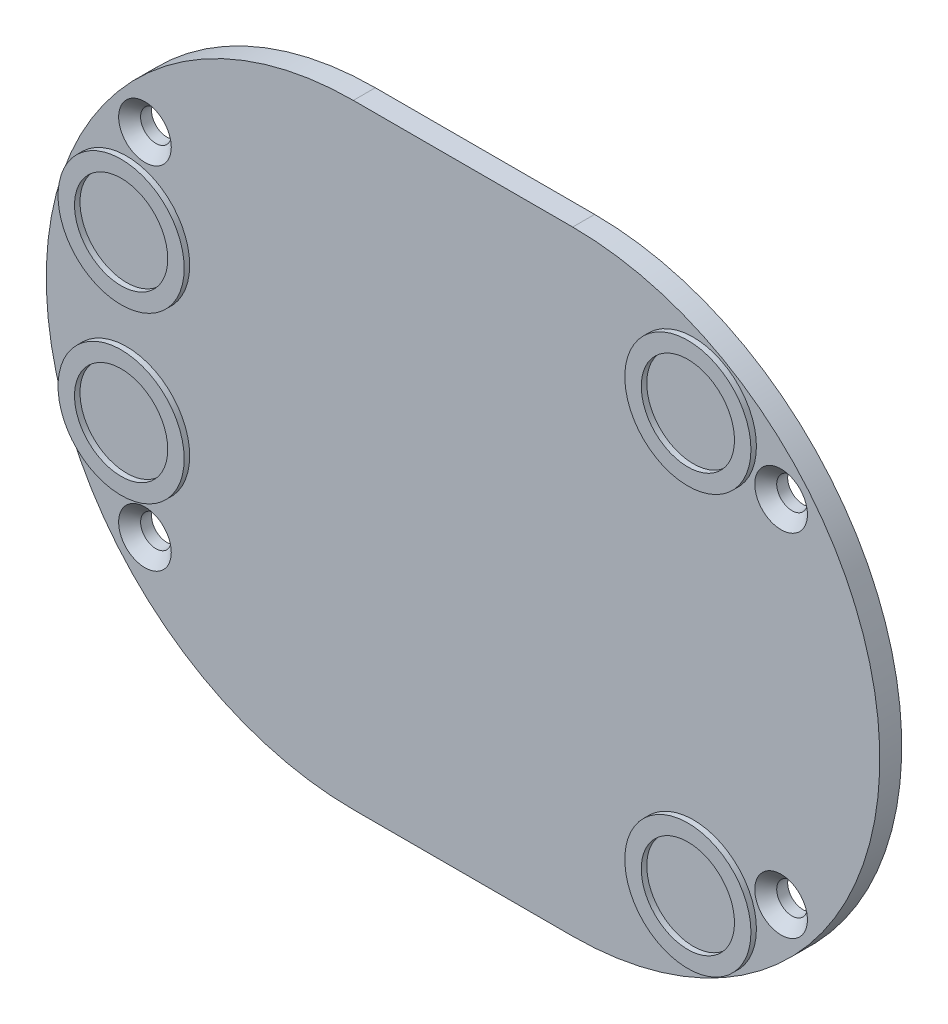
ISO-10303-21;
HEADER;
FILE_DESCRIPTION(('STEP AP214'),'2;1');
FILE_NAME('part.step','',(''),(''),'','','');
FILE_SCHEMA(('AUTOMOTIVE_DESIGN { 1 0 10303 214 1 1 1 1 }'));
ENDSEC;
DATA;
#1=APPLICATION_CONTEXT('core data for automotive mechanical design processes');
#2=APPLICATION_PROTOCOL_DEFINITION('international standard','automotive_design',2000,#1);
#3=PRODUCT_CONTEXT('',#1,'mechanical');
#4=PRODUCT('Part','Part','',(#3));
#5=PRODUCT_RELATED_PRODUCT_CATEGORY('part','',(#4));
#6=PRODUCT_DEFINITION_FORMATION('','',#4);
#7=PRODUCT_DEFINITION_CONTEXT('part definition',#1,'design');
#8=PRODUCT_DEFINITION('design','',#6,#7);
#9=PRODUCT_DEFINITION_SHAPE('','',#8);
#10=(LENGTH_UNIT() NAMED_UNIT(*) SI_UNIT(.MILLI.,.METRE.));
#11=(NAMED_UNIT(*) PLANE_ANGLE_UNIT() SI_UNIT($,.RADIAN.));
#12=(NAMED_UNIT(*) SI_UNIT($,.STERADIAN.) SOLID_ANGLE_UNIT());
#13=UNCERTAINTY_MEASURE_WITH_UNIT(LENGTH_MEASURE(1.E-05),#10,'distance_accuracy_value','');
#14=(GEOMETRIC_REPRESENTATION_CONTEXT(3) GLOBAL_UNCERTAINTY_ASSIGNED_CONTEXT((#13)) GLOBAL_UNIT_ASSIGNED_CONTEXT((#10,
#11,#12)) REPRESENTATION_CONTEXT('',''));
#15=CARTESIAN_POINT('',(0.,0.,0.));
#16=DIRECTION('',(0.,0.,1.));
#17=DIRECTION('',(1.,0.,0.));
#18=AXIS2_PLACEMENT_3D('',#15,#16,#17);
#19=CARTESIAN_POINT('',(-10.,0.,2.));
#20=DIRECTION('',(0.,0.,-1.));
#21=DIRECTION('',(-1.,0.,0.));
#22=AXIS2_PLACEMENT_3D('',#19,#20,#21);
#23=CYLINDRICAL_SURFACE('',#22,28.);
#24=CARTESIAN_POINT('',(-10.,0.,0.));
#25=DIRECTION('',(0.,0.,1.));
#26=DIRECTION('',(1.,0.,0.));
#27=AXIS2_PLACEMENT_3D('',#24,#25,#26);
#28=CIRCLE('',#27,28.);
#29=CARTESIAN_POINT('',(-10.,28.,0.));
#30=VERTEX_POINT('',#29);
#31=CARTESIAN_POINT('',(-10.,-28.,0.));
#32=VERTEX_POINT('',#31);
#33=EDGE_CURVE('E249',#30,#32,#28,.T.);
#34=ORIENTED_EDGE('',*,*,#33,.T.);
#35=DIRECTION('',(0.,0.,-1.));
#36=VECTOR('',#35,1.);
#37=CARTESIAN_POINT('',(-10.,-28.,2.));
#38=LINE('',#37,#36);
#39=CARTESIAN_POINT('',(-10.,-28.,2.));
#40=VERTEX_POINT('',#39);
#41=EDGE_CURVE('E265',#40,#32,#38,.T.);
#42=ORIENTED_EDGE('',*,*,#41,.F.);
#43=CARTESIAN_POINT('',(-10.,0.,2.));
#44=DIRECTION('',(0.,0.,1.));
#45=DIRECTION('',(1.,0.,0.));
#46=AXIS2_PLACEMENT_3D('',#43,#44,#45);
#47=CIRCLE('',#46,28.);
#48=CARTESIAN_POINT('',(-10.,28.,2.));
#49=VERTEX_POINT('',#48);
#50=EDGE_CURVE('E237',#49,#40,#47,.T.);
#51=ORIENTED_EDGE('',*,*,#50,.F.);
#52=DIRECTION('',(0.,0.,-1.));
#53=VECTOR('',#52,1.);
#54=CARTESIAN_POINT('',(-10.,28.,2.));
#55=LINE('',#54,#53);
#56=EDGE_CURVE('E248',#49,#30,#55,.T.);
#57=ORIENTED_EDGE('',*,*,#56,.T.);
#58=EDGE_LOOP('',(#34,#42,#51,#57));
#59=FACE_BOUND('',#58,.T.);
#60=ADVANCED_FACE('F62',(#59),#23,.T.);
#61=CARTESIAN_POINT('',(10.,-28.,2.));
#62=DIRECTION('',(0.,-1.,0.));
#63=DIRECTION('',(1.,0.,0.));
#64=AXIS2_PLACEMENT_3D('',#61,#62,#63);
#65=PLANE('',#64);
#66=DIRECTION('',(-1.,0.,0.));
#67=VECTOR('',#66,1.);
#68=CARTESIAN_POINT('',(10.,-28.,0.));
#69=LINE('',#68,#67);
#70=CARTESIAN_POINT('',(10.,-28.,0.));
#71=VERTEX_POINT('',#70);
#72=EDGE_CURVE('E252',#71,#32,#69,.T.);
#73=ORIENTED_EDGE('',*,*,#72,.F.);
#74=DIRECTION('',(0.,0.,-1.));
#75=VECTOR('',#74,1.);
#76=CARTESIAN_POINT('',(10.,-28.,2.));
#77=LINE('',#76,#75);
#78=CARTESIAN_POINT('',(10.,-28.,2.));
#79=VERTEX_POINT('',#78);
#80=EDGE_CURVE('E263',#79,#71,#77,.T.);
#81=ORIENTED_EDGE('',*,*,#80,.F.);
#82=DIRECTION('',(-1.,0.,0.));
#83=VECTOR('',#82,1.);
#84=CARTESIAN_POINT('',(10.,-28.,2.));
#85=LINE('',#84,#83);
#86=EDGE_CURVE('E239',#79,#40,#85,.T.);
#87=ORIENTED_EDGE('',*,*,#86,.T.);
#88=ORIENTED_EDGE('',*,*,#41,.T.);
#89=EDGE_LOOP('',(#73,#81,#87,#88));
#90=FACE_BOUND('',#89,.T.);
#91=ADVANCED_FACE('F323',(#90),#65,.T.);
#92=CARTESIAN_POINT('',(10.,0.,2.));
#93=DIRECTION('',(0.,0.,-1.));
#94=DIRECTION('',(-1.,0.,0.));
#95=AXIS2_PLACEMENT_3D('',#92,#93,#94);
#96=CYLINDRICAL_SURFACE('',#95,28.);
#97=CARTESIAN_POINT('',(10.,0.,0.));
#98=DIRECTION('',(0.,0.,1.));
#99=DIRECTION('',(1.,0.,0.));
#100=AXIS2_PLACEMENT_3D('',#97,#98,#99);
#101=CIRCLE('',#100,28.);
#102=CARTESIAN_POINT('',(10.,28.,0.));
#103=VERTEX_POINT('',#102);
#104=EDGE_CURVE('E255',#71,#103,#101,.T.);
#105=ORIENTED_EDGE('',*,*,#104,.T.);
#106=DIRECTION('',(0.,0.,-1.));
#107=VECTOR('',#106,1.);
#108=CARTESIAN_POINT('',(10.,28.,2.));
#109=LINE('',#108,#107);
#110=CARTESIAN_POINT('',(10.,28.,2.));
#111=VERTEX_POINT('',#110);
#112=EDGE_CURVE('E261',#111,#103,#109,.T.);
#113=ORIENTED_EDGE('',*,*,#112,.F.);
#114=CARTESIAN_POINT('',(10.,0.,2.));
#115=DIRECTION('',(0.,0.,1.));
#116=DIRECTION('',(1.,0.,0.));
#117=AXIS2_PLACEMENT_3D('',#114,#115,#116);
#118=CIRCLE('',#117,28.);
#119=EDGE_CURVE('E243',#79,#111,#118,.T.);
#120=ORIENTED_EDGE('',*,*,#119,.F.);
#121=ORIENTED_EDGE('',*,*,#80,.T.);
#122=EDGE_LOOP('',(#105,#113,#120,#121));
#123=FACE_BOUND('',#122,.T.);
#124=ADVANCED_FACE('F329',(#123),#96,.T.);
#125=CARTESIAN_POINT('',(-10.,28.,2.));
#126=DIRECTION('',(0.,1.,0.));
#127=DIRECTION('',(-1.,0.,0.));
#128=AXIS2_PLACEMENT_3D('',#125,#126,#127);
#129=PLANE('',#128);
#130=DIRECTION('',(1.,0.,0.));
#131=VECTOR('',#130,1.);
#132=CARTESIAN_POINT('',(-10.,28.,0.));
#133=LINE('',#132,#131);
#134=EDGE_CURVE('E240',#30,#103,#133,.T.);
#135=ORIENTED_EDGE('',*,*,#134,.F.);
#136=ORIENTED_EDGE('',*,*,#56,.F.);
#137=DIRECTION('',(1.,0.,0.));
#138=VECTOR('',#137,1.);
#139=CARTESIAN_POINT('',(-10.,28.,2.));
#140=LINE('',#139,#138);
#141=EDGE_CURVE('E245',#49,#111,#140,.T.);
#142=ORIENTED_EDGE('',*,*,#141,.T.);
#143=ORIENTED_EDGE('',*,*,#112,.T.);
#144=EDGE_LOOP('',(#135,#136,#142,#143));
#145=FACE_BOUND('',#144,.T.);
#146=ADVANCED_FACE('F589',(#145),#129,.T.);
#147=CARTESIAN_POINT('',(-10.,0.,2.));
#148=DIRECTION('',(0.,0.,1.));
#149=DIRECTION('',(1.,0.,0.));
#150=AXIS2_PLACEMENT_3D('',#147,#148,#149);
#151=PLANE('',#150);
#152=CARTESIAN_POINT('',(-30.67323765729,-7.52444315316473,2.));
#153=DIRECTION('',(0.,0.,1.));
#154=DIRECTION('',(1.,0.,0.));
#155=AXIS2_PLACEMENT_3D('',#152,#153,#154);
#156=CIRCLE('',#155,5.75);
#157=CARTESIAN_POINT('',(-24.92323765729,-7.52444315316473,2.));
#158=VERTEX_POINT('',#157);
#159=EDGE_CURVE('E194',#158,#158,#156,.T.);
#160=ORIENTED_EDGE('',*,*,#159,.F.);
#161=EDGE_LOOP('',(#160));
#162=FACE_BOUND('',#161,.T.);
#163=CARTESIAN_POINT('',(21.0000000000001,19.0525588832576,2.));
#164=DIRECTION('',(0.,0.,1.));
#165=DIRECTION('',(1.,0.,0.));
#166=AXIS2_PLACEMENT_3D('',#163,#164,#165);
#167=CIRCLE('',#166,5.75);
#168=CARTESIAN_POINT('',(26.7500000000001,19.0525588832576,2.));
#169=VERTEX_POINT('',#168);
#170=EDGE_CURVE('E176',#169,#169,#167,.T.);
#171=ORIENTED_EDGE('',*,*,#170,.F.);
#172=EDGE_LOOP('',(#171));
#173=FACE_BOUND('',#172,.T.);
#174=CARTESIAN_POINT('',(21.0000000000001,-19.0525588832576,2.));
#175=DIRECTION('',(0.,0.,1.));
#176=DIRECTION('',(1.,0.,0.));
#177=AXIS2_PLACEMENT_3D('',#174,#175,#176);
#178=CIRCLE('',#177,5.75);
#179=CARTESIAN_POINT('',(26.7500000000001,-19.0525588832576,2.));
#180=VERTEX_POINT('',#179);
#181=EDGE_CURVE('E185',#180,#180,#178,.T.);
#182=ORIENTED_EDGE('',*,*,#181,.F.);
#183=EDGE_LOOP('',(#182));
#184=FACE_BOUND('',#183,.T.);
#185=CARTESIAN_POINT('',(-30.67323765729,7.52444315316473,2.));
#186=DIRECTION('',(0.,0.,1.));
#187=DIRECTION('',(1.,0.,0.));
#188=AXIS2_PLACEMENT_3D('',#185,#186,#187);
#189=CIRCLE('',#188,5.75);
#190=CARTESIAN_POINT('',(-24.92323765729,7.52444315316473,2.));
#191=VERTEX_POINT('',#190);
#192=EDGE_CURVE('E203',#191,#191,#189,.T.);
#193=ORIENTED_EDGE('',*,*,#192,.F.);
#194=EDGE_LOOP('',(#193));
#195=FACE_BOUND('',#194,.T.);
#196=CARTESIAN_POINT('',(-29.,16.,2.));
#197=DIRECTION('',(0.,0.,1.));
#198=DIRECTION('',(1.,0.,0.));
#199=AXIS2_PLACEMENT_3D('',#196,#197,#198);
#200=CIRCLE('',#199,2.4);
#201=CARTESIAN_POINT('',(-26.6,16.,2.));
#202=VERTEX_POINT('',#201);
#203=EDGE_CURVE('E207',#202,#202,#200,.T.);
#204=ORIENTED_EDGE('',*,*,#203,.F.);
#205=EDGE_LOOP('',(#204));
#206=FACE_BOUND('',#205,.T.);
#207=CARTESIAN_POINT('',(-29.,-16.,2.));
#208=DIRECTION('',(0.,0.,1.));
#209=DIRECTION('',(1.,0.,0.));
#210=AXIS2_PLACEMENT_3D('',#207,#208,#209);
#211=CIRCLE('',#210,2.4);
#212=CARTESIAN_POINT('',(-26.6,-16.,2.));
#213=VERTEX_POINT('',#212);
#214=EDGE_CURVE('E216',#213,#213,#211,.T.);
#215=ORIENTED_EDGE('',*,*,#214,.F.);
#216=EDGE_LOOP('',(#215));
#217=FACE_BOUND('',#216,.T.);
#218=CARTESIAN_POINT('',(29.,16.,2.));
#219=DIRECTION('',(0.,0.,1.));
#220=DIRECTION('',(1.,0.,0.));
#221=AXIS2_PLACEMENT_3D('',#218,#219,#220);
#222=CIRCLE('',#221,2.4);
#223=CARTESIAN_POINT('',(31.4,16.,2.));
#224=VERTEX_POINT('',#223);
#225=EDGE_CURVE('E223',#224,#224,#222,.T.);
#226=ORIENTED_EDGE('',*,*,#225,.F.);
#227=EDGE_LOOP('',(#226));
#228=FACE_BOUND('',#227,.T.);
#229=CARTESIAN_POINT('',(29.,-16.,2.));
#230=DIRECTION('',(0.,0.,1.));
#231=DIRECTION('',(1.,0.,0.));
#232=AXIS2_PLACEMENT_3D('',#229,#230,#231);
#233=CIRCLE('',#232,2.4);
#234=CARTESIAN_POINT('',(31.4,-16.,2.));
#235=VERTEX_POINT('',#234);
#236=EDGE_CURVE('E230',#235,#235,#233,.T.);
#237=ORIENTED_EDGE('',*,*,#236,.F.);
#238=EDGE_LOOP('',(#237));
#239=FACE_BOUND('',#238,.T.);
#240=ORIENTED_EDGE('',*,*,#50,.T.);
#241=ORIENTED_EDGE('',*,*,#86,.F.);
#242=ORIENTED_EDGE('',*,*,#119,.T.);
#243=ORIENTED_EDGE('',*,*,#141,.F.);
#244=EDGE_LOOP('',(#240,#241,#242,#243));
#245=FACE_BOUND('',#244,.T.);
#246=ADVANCED_FACE('F391',(#162,#173,#184,#195,#206,#217,#228,#239,#245),#151,.T.);
#247=CARTESIAN_POINT('',(-10.,0.,0.));
#248=DIRECTION('',(0.,0.,1.));
#249=DIRECTION('',(1.,0.,0.));
#250=AXIS2_PLACEMENT_3D('',#247,#248,#249);
#251=PLANE('',#250);
#252=CARTESIAN_POINT('',(-10.,0.,0.));
#253=DIRECTION('',(0.,0.,1.));
#254=DIRECTION('',(1.,0.,0.));
#255=AXIS2_PLACEMENT_3D('',#252,#253,#254);
#256=CIRCLE('',#255,20.5);
#257=CARTESIAN_POINT('',(-27.6609508989296,-10.4086893192946,0.));
#258=VERTEX_POINT('',#257);
#259=CARTESIAN_POINT('',(-8.20469615485114,-20.4212361061615,0.));
#260=VERTEX_POINT('',#259);
#261=EDGE_CURVE('E294',#258,#260,#256,.T.);
#262=ORIENTED_EDGE('',*,*,#261,.T.);
#263=DIRECTION('',(0.0875757973243352,-0.996157858837146,0.));
#264=VECTOR('',#263,1.);
#265=CARTESIAN_POINT('',(-10.,0.,0.));
#266=LINE('',#265,#264);
#267=CARTESIAN_POINT('',(-8.68636304013498,-14.9423678825572,0.));
#268=VERTEX_POINT('',#267);
#269=EDGE_CURVE('E287',#268,#260,#266,.T.);
#270=ORIENTED_EDGE('',*,*,#269,.F.);
#271=CARTESIAN_POINT('',(-10.,0.,0.));
#272=DIRECTION('',(0.,0.,1.));
#273=DIRECTION('',(1.,0.,0.));
#274=AXIS2_PLACEMENT_3D('',#271,#272,#273);
#275=CIRCLE('',#274,15.);
#276=CARTESIAN_POINT('',(-22.9226469992168,-7.61611413606923,0.));
#277=VERTEX_POINT('',#276);
#278=EDGE_CURVE('E291',#268,#277,#275,.F.);
#279=ORIENTED_EDGE('',*,*,#278,.T.);
#280=DIRECTION('',(0.861509799947785,0.507740942404616,0.));
#281=VECTOR('',#280,1.);
#282=CARTESIAN_POINT('',(-10.,0.,0.));
#283=LINE('',#282,#281);
#284=EDGE_CURVE('E289',#258,#277,#283,.T.);
#285=ORIENTED_EDGE('',*,*,#284,.F.);
#286=EDGE_LOOP('',(#262,#270,#279,#285));
#287=FACE_BOUND('',#286,.T.);
#288=CARTESIAN_POINT('',(-29.,16.,0.));
#289=DIRECTION('',(0.,0.,1.));
#290=DIRECTION('',(1.,0.,0.));
#291=AXIS2_PLACEMENT_3D('',#288,#289,#290);
#292=CIRCLE('',#291,1.4);
#293=CARTESIAN_POINT('',(-27.6,16.,0.));
#294=VERTEX_POINT('',#293);
#295=EDGE_CURVE('E215',#294,#294,#292,.T.);
#296=ORIENTED_EDGE('',*,*,#295,.T.);
#297=EDGE_LOOP('',(#296));
#298=FACE_BOUND('',#297,.T.);
#299=CARTESIAN_POINT('',(-29.,-16.,0.));
#300=DIRECTION('',(0.,0.,1.));
#301=DIRECTION('',(1.,0.,0.));
#302=AXIS2_PLACEMENT_3D('',#299,#300,#301);
#303=CIRCLE('',#302,1.4);
#304=CARTESIAN_POINT('',(-27.6,-16.,0.));
#305=VERTEX_POINT('',#304);
#306=EDGE_CURVE('E222',#305,#305,#303,.T.);
#307=ORIENTED_EDGE('',*,*,#306,.T.);
#308=EDGE_LOOP('',(#307));
#309=FACE_BOUND('',#308,.T.);
#310=CARTESIAN_POINT('',(29.,16.,0.));
#311=DIRECTION('',(0.,0.,1.));
#312=DIRECTION('',(1.,0.,0.));
#313=AXIS2_PLACEMENT_3D('',#310,#311,#312);
#314=CIRCLE('',#313,1.4);
#315=CARTESIAN_POINT('',(30.4,16.,0.));
#316=VERTEX_POINT('',#315);
#317=EDGE_CURVE('E229',#316,#316,#314,.T.);
#318=ORIENTED_EDGE('',*,*,#317,.T.);
#319=EDGE_LOOP('',(#318));
#320=FACE_BOUND('',#319,.T.);
#321=CARTESIAN_POINT('',(29.,-16.,0.));
#322=DIRECTION('',(0.,0.,1.));
#323=DIRECTION('',(1.,0.,0.));
#324=AXIS2_PLACEMENT_3D('',#321,#322,#323);
#325=CIRCLE('',#324,1.4);
#326=CARTESIAN_POINT('',(30.4,-16.,0.));
#327=VERTEX_POINT('',#326);
#328=EDGE_CURVE('E236',#327,#327,#325,.T.);
#329=ORIENTED_EDGE('',*,*,#328,.T.);
#330=EDGE_LOOP('',(#329));
#331=FACE_BOUND('',#330,.T.);
#332=ORIENTED_EDGE('',*,*,#33,.F.);
#333=ORIENTED_EDGE('',*,*,#134,.T.);
#334=ORIENTED_EDGE('',*,*,#104,.F.);
#335=ORIENTED_EDGE('',*,*,#72,.T.);
#336=EDGE_LOOP('',(#332,#333,#334,#335));
#337=FACE_BOUND('',#336,.T.);
#338=ADVANCED_FACE('F305',(#287,#298,#309,#320,#331,#337),#251,.F.);
#339=CARTESIAN_POINT('',(29.,-16.,2.));
#340=DIRECTION('',(0.,0.,1.));
#341=DIRECTION('',(1.,0.,0.));
#342=AXIS2_PLACEMENT_3D('',#339,#340,#341);
#343=CYLINDRICAL_SURFACE('',#342,1.4);
#344=CARTESIAN_POINT('',(29.,-16.,0.999999999999999));
#345=DIRECTION('',(0.,0.,1.));
#346=DIRECTION('',(1.,0.,0.));
#347=AXIS2_PLACEMENT_3D('',#344,#345,#346);
#348=CIRCLE('',#347,1.4);
#349=CARTESIAN_POINT('',(30.4,-16.,0.999999999999999));
#350=VERTEX_POINT('',#349);
#351=EDGE_CURVE('E233',#350,#350,#348,.T.);
#352=ORIENTED_EDGE('',*,*,#351,.T.);
#353=EDGE_LOOP('',(#352));
#354=FACE_BOUND('',#353,.T.);
#355=ORIENTED_EDGE('',*,*,#328,.F.);
#356=EDGE_LOOP('',(#355));
#357=FACE_BOUND('',#356,.T.);
#358=ADVANCED_FACE('F390',(#354,#357),#343,.F.);
#359=CARTESIAN_POINT('',(29.,-16.,2.));
#360=DIRECTION('',(0.,0.,1.));
#361=DIRECTION('',(1.,0.,0.));
#362=AXIS2_PLACEMENT_3D('',#359,#360,#361);
#363=CONICAL_SURFACE('',#362,2.4,0.78539816339745);
#364=ORIENTED_EDGE('',*,*,#351,.F.);
#365=EDGE_LOOP('',(#364));
#366=FACE_BOUND('',#365,.T.);
#367=ORIENTED_EDGE('',*,*,#236,.T.);
#368=EDGE_LOOP('',(#367));
#369=FACE_BOUND('',#368,.T.);
#370=ADVANCED_FACE('F406',(#366,#369),#363,.F.);
#371=CARTESIAN_POINT('',(29.,16.,2.));
#372=DIRECTION('',(0.,0.,1.));
#373=DIRECTION('',(1.,0.,0.));
#374=AXIS2_PLACEMENT_3D('',#371,#372,#373);
#375=CYLINDRICAL_SURFACE('',#374,1.4);
#376=CARTESIAN_POINT('',(29.,16.,0.999999999999999));
#377=DIRECTION('',(0.,0.,1.));
#378=DIRECTION('',(1.,0.,0.));
#379=AXIS2_PLACEMENT_3D('',#376,#377,#378);
#380=CIRCLE('',#379,1.4);
#381=CARTESIAN_POINT('',(30.4,16.,0.999999999999999));
#382=VERTEX_POINT('',#381);
#383=EDGE_CURVE('E226',#382,#382,#380,.T.);
#384=ORIENTED_EDGE('',*,*,#383,.T.);
#385=EDGE_LOOP('',(#384));
#386=FACE_BOUND('',#385,.T.);
#387=ORIENTED_EDGE('',*,*,#317,.F.);
#388=EDGE_LOOP('',(#387));
#389=FACE_BOUND('',#388,.T.);
#390=ADVANCED_FACE('F414',(#386,#389),#375,.F.);
#391=CARTESIAN_POINT('',(29.,16.,2.));
#392=DIRECTION('',(0.,0.,1.));
#393=DIRECTION('',(1.,0.,0.));
#394=AXIS2_PLACEMENT_3D('',#391,#392,#393);
#395=CONICAL_SURFACE('',#394,2.4,0.78539816339745);
#396=ORIENTED_EDGE('',*,*,#383,.F.);
#397=EDGE_LOOP('',(#396));
#398=FACE_BOUND('',#397,.T.);
#399=ORIENTED_EDGE('',*,*,#225,.T.);
#400=EDGE_LOOP('',(#399));
#401=FACE_BOUND('',#400,.T.);
#402=ADVANCED_FACE('F422',(#398,#401),#395,.F.);
#403=CARTESIAN_POINT('',(-29.,-16.,2.));
#404=DIRECTION('',(0.,0.,1.));
#405=DIRECTION('',(1.,0.,0.));
#406=AXIS2_PLACEMENT_3D('',#403,#404,#405);
#407=CYLINDRICAL_SURFACE('',#406,1.4);
#408=CARTESIAN_POINT('',(-29.,-16.,0.999999999999999));
#409=DIRECTION('',(0.,0.,1.));
#410=DIRECTION('',(1.,0.,0.));
#411=AXIS2_PLACEMENT_3D('',#408,#409,#410);
#412=CIRCLE('',#411,1.4);
#413=CARTESIAN_POINT('',(-27.6,-16.,0.999999999999999));
#414=VERTEX_POINT('',#413);
#415=EDGE_CURVE('E219',#414,#414,#412,.T.);
#416=ORIENTED_EDGE('',*,*,#415,.T.);
#417=EDGE_LOOP('',(#416));
#418=FACE_BOUND('',#417,.T.);
#419=ORIENTED_EDGE('',*,*,#306,.F.);
#420=EDGE_LOOP('',(#419));
#421=FACE_BOUND('',#420,.T.);
#422=ADVANCED_FACE('F430',(#418,#421),#407,.F.);
#423=CARTESIAN_POINT('',(-29.,-16.,2.));
#424=DIRECTION('',(0.,0.,1.));
#425=DIRECTION('',(1.,0.,0.));
#426=AXIS2_PLACEMENT_3D('',#423,#424,#425);
#427=CONICAL_SURFACE('',#426,2.4,0.785398163397448);
#428=ORIENTED_EDGE('',*,*,#415,.F.);
#429=EDGE_LOOP('',(#428));
#430=FACE_BOUND('',#429,.T.);
#431=ORIENTED_EDGE('',*,*,#214,.T.);
#432=EDGE_LOOP('',(#431));
#433=FACE_BOUND('',#432,.T.);
#434=ADVANCED_FACE('F438',(#430,#433),#427,.F.);
#435=CARTESIAN_POINT('',(-29.,16.,2.));
#436=DIRECTION('',(0.,0.,1.));
#437=DIRECTION('',(1.,0.,0.));
#438=AXIS2_PLACEMENT_3D('',#435,#436,#437);
#439=CYLINDRICAL_SURFACE('',#438,1.4);
#440=CARTESIAN_POINT('',(-29.,16.,0.999999999999999));
#441=DIRECTION('',(0.,0.,1.));
#442=DIRECTION('',(1.,0.,0.));
#443=AXIS2_PLACEMENT_3D('',#440,#441,#442);
#444=CIRCLE('',#443,1.4);
#445=CARTESIAN_POINT('',(-27.6,16.,0.999999999999999));
#446=VERTEX_POINT('',#445);
#447=EDGE_CURVE('E212',#446,#446,#444,.T.);
#448=ORIENTED_EDGE('',*,*,#447,.T.);
#449=EDGE_LOOP('',(#448));
#450=FACE_BOUND('',#449,.T.);
#451=ORIENTED_EDGE('',*,*,#295,.F.);
#452=EDGE_LOOP('',(#451));
#453=FACE_BOUND('',#452,.T.);
#454=ADVANCED_FACE('F446',(#450,#453),#439,.F.);
#455=CARTESIAN_POINT('',(-29.,16.,2.));
#456=DIRECTION('',(0.,0.,1.));
#457=DIRECTION('',(1.,0.,0.));
#458=AXIS2_PLACEMENT_3D('',#455,#456,#457);
#459=CONICAL_SURFACE('',#458,2.4,0.785398163397448);
#460=ORIENTED_EDGE('',*,*,#447,.F.);
#461=EDGE_LOOP('',(#460));
#462=FACE_BOUND('',#461,.T.);
#463=ORIENTED_EDGE('',*,*,#203,.T.);
#464=EDGE_LOOP('',(#463));
#465=FACE_BOUND('',#464,.T.);
#466=ADVANCED_FACE('F454',(#462,#465),#459,.F.);
#467=CARTESIAN_POINT('',(-30.67323765729,7.52444315316473,2.5));
#468=DIRECTION('',(0.,0.,1.));
#469=DIRECTION('',(1.,0.,0.));
#470=AXIS2_PLACEMENT_3D('',#467,#468,#469);
#471=PLANE('',#470);
#472=CARTESIAN_POINT('',(-30.67323765729,7.52444315316473,2.5));
#473=DIRECTION('',(0.,0.,1.));
#474=DIRECTION('',(1.,0.,0.));
#475=AXIS2_PLACEMENT_3D('',#472,#473,#474);
#476=CIRCLE('',#475,5.75);
#477=CARTESIAN_POINT('',(-24.92323765729,7.52444315316473,2.5));
#478=VERTEX_POINT('',#477);
#479=EDGE_CURVE('E204',#478,#478,#476,.T.);
#480=ORIENTED_EDGE('',*,*,#479,.T.);
#481=EDGE_LOOP('',(#480));
#482=FACE_BOUND('',#481,.T.);
#483=CARTESIAN_POINT('',(-30.67323765729,7.52444315316473,2.5));
#484=DIRECTION('',(0.,0.,1.));
#485=DIRECTION('',(1.,0.,0.));
#486=AXIS2_PLACEMENT_3D('',#483,#484,#485);
#487=CIRCLE('',#486,4.25);
#488=CARTESIAN_POINT('',(-26.42323765729,7.52444315316473,2.5));
#489=VERTEX_POINT('',#488);
#490=EDGE_CURVE('E198',#489,#489,#487,.T.);
#491=ORIENTED_EDGE('',*,*,#490,.F.);
#492=EDGE_LOOP('',(#491));
#493=FACE_BOUND('',#492,.T.);
#494=ADVANCED_FACE('F462',(#482,#493),#471,.T.);
#495=CARTESIAN_POINT('',(-30.67323765729,7.52444315316473,2.5));
#496=DIRECTION('',(0.,0.,-1.));
#497=DIRECTION('',(-1.,0.,0.));
#498=AXIS2_PLACEMENT_3D('',#495,#496,#497);
#499=CYLINDRICAL_SURFACE('',#498,5.75);
#500=ORIENTED_EDGE('',*,*,#479,.F.);
#501=EDGE_LOOP('',(#500));
#502=FACE_BOUND('',#501,.T.);
#503=ORIENTED_EDGE('',*,*,#192,.T.);
#504=EDGE_LOOP('',(#503));
#505=FACE_BOUND('',#504,.T.);
#506=ADVANCED_FACE('F470',(#502,#505),#499,.T.);
#507=CARTESIAN_POINT('',(-30.67323765729,7.52444315316473,2.5));
#508=DIRECTION('',(0.,0.,-1.));
#509=DIRECTION('',(-1.,0.,0.));
#510=AXIS2_PLACEMENT_3D('',#507,#508,#509);
#511=CYLINDRICAL_SURFACE('',#510,4.25);
#512=ORIENTED_EDGE('',*,*,#490,.T.);
#513=EDGE_LOOP('',(#512));
#514=FACE_BOUND('',#513,.T.);
#515=CARTESIAN_POINT('',(-30.67323765729,7.52444315316473,2.));
#516=DIRECTION('',(0.,0.,1.));
#517=DIRECTION('',(1.,0.,0.));
#518=AXIS2_PLACEMENT_3D('',#515,#516,#517);
#519=CIRCLE('',#518,4.25);
#520=CARTESIAN_POINT('',(-26.42323765729,7.52444315316473,2.));
#521=VERTEX_POINT('',#520);
#522=EDGE_CURVE('E267',#521,#521,#519,.F.);
#523=ORIENTED_EDGE('',*,*,#522,.T.);
#524=EDGE_LOOP('',(#523));
#525=FACE_BOUND('',#524,.T.);
#526=ADVANCED_FACE('F478',(#514,#525),#511,.F.);
#527=ORIENTED_EDGE('',*,*,#522,.F.);
#528=EDGE_LOOP('',(#527));
#529=FACE_BOUND('',#528,.T.);
#530=ADVANCED_FACE('F486',(#529),#151,.T.);
#531=CARTESIAN_POINT('',(-30.67323765729,-7.52444315316473,2.5));
#532=DIRECTION('',(0.,0.,1.));
#533=DIRECTION('',(1.,0.,0.));
#534=AXIS2_PLACEMENT_3D('',#531,#532,#533);
#535=PLANE('',#534);
#536=CARTESIAN_POINT('',(-30.67323765729,-7.52444315316473,2.5));
#537=DIRECTION('',(0.,0.,1.));
#538=DIRECTION('',(1.,0.,0.));
#539=AXIS2_PLACEMENT_3D('',#536,#537,#538);
#540=CIRCLE('',#539,5.75);
#541=CARTESIAN_POINT('',(-24.92323765729,-7.52444315316473,2.5));
#542=VERTEX_POINT('',#541);
#543=EDGE_CURVE('E195',#542,#542,#540,.T.);
#544=ORIENTED_EDGE('',*,*,#543,.T.);
#545=EDGE_LOOP('',(#544));
#546=FACE_BOUND('',#545,.T.);
#547=CARTESIAN_POINT('',(-30.67323765729,-7.52444315316473,2.5));
#548=DIRECTION('',(0.,0.,1.));
#549=DIRECTION('',(1.,0.,0.));
#550=AXIS2_PLACEMENT_3D('',#547,#548,#549);
#551=CIRCLE('',#550,4.25);
#552=CARTESIAN_POINT('',(-26.42323765729,-7.52444315316473,2.5));
#553=VERTEX_POINT('',#552);
#554=EDGE_CURVE('E189',#553,#553,#551,.T.);
#555=ORIENTED_EDGE('',*,*,#554,.F.);
#556=EDGE_LOOP('',(#555));
#557=FACE_BOUND('',#556,.T.);
#558=ADVANCED_FACE('F494',(#546,#557),#535,.T.);
#559=CARTESIAN_POINT('',(-30.67323765729,-7.52444315316473,2.5));
#560=DIRECTION('',(0.,0.,-1.));
#561=DIRECTION('',(-1.,0.,0.));
#562=AXIS2_PLACEMENT_3D('',#559,#560,#561);
#563=CYLINDRICAL_SURFACE('',#562,5.75);
#564=ORIENTED_EDGE('',*,*,#543,.F.);
#565=EDGE_LOOP('',(#564));
#566=FACE_BOUND('',#565,.T.);
#567=ORIENTED_EDGE('',*,*,#159,.T.);
#568=EDGE_LOOP('',(#567));
#569=FACE_BOUND('',#568,.T.);
#570=ADVANCED_FACE('F503',(#566,#569),#563,.T.);
#571=CARTESIAN_POINT('',(-30.67323765729,-7.52444315316473,2.5));
#572=DIRECTION('',(0.,0.,-1.));
#573=DIRECTION('',(-1.,0.,0.));
#574=AXIS2_PLACEMENT_3D('',#571,#572,#573);
#575=CYLINDRICAL_SURFACE('',#574,4.25);
#576=ORIENTED_EDGE('',*,*,#554,.T.);
#577=EDGE_LOOP('',(#576));
#578=FACE_BOUND('',#577,.T.);
#579=CARTESIAN_POINT('',(-30.67323765729,-7.52444315316473,2.));
#580=DIRECTION('',(0.,0.,1.));
#581=DIRECTION('',(1.,0.,0.));
#582=AXIS2_PLACEMENT_3D('',#579,#580,#581);
#583=CIRCLE('',#582,4.25);
#584=CARTESIAN_POINT('',(-26.42323765729,-7.52444315316473,2.));
#585=VERTEX_POINT('',#584);
#586=EDGE_CURVE('E278',#585,#585,#583,.F.);
#587=ORIENTED_EDGE('',*,*,#586,.T.);
#588=EDGE_LOOP('',(#587));
#589=FACE_BOUND('',#588,.T.);
#590=ADVANCED_FACE('F511',(#578,#589),#575,.F.);
#591=ORIENTED_EDGE('',*,*,#586,.F.);
#592=EDGE_LOOP('',(#591));
#593=FACE_BOUND('',#592,.T.);
#594=ADVANCED_FACE('F497',(#593),#151,.T.);
#595=CARTESIAN_POINT('',(21.0000000000001,-19.0525588832576,2.5));
#596=DIRECTION('',(0.,0.,1.));
#597=DIRECTION('',(1.,0.,0.));
#598=AXIS2_PLACEMENT_3D('',#595,#596,#597);
#599=PLANE('',#598);
#600=CARTESIAN_POINT('',(21.0000000000001,-19.0525588832576,2.5));
#601=DIRECTION('',(0.,0.,1.));
#602=DIRECTION('',(1.,0.,0.));
#603=AXIS2_PLACEMENT_3D('',#600,#601,#602);
#604=CIRCLE('',#603,5.75);
#605=CARTESIAN_POINT('',(26.7500000000001,-19.0525588832576,2.5));
#606=VERTEX_POINT('',#605);
#607=EDGE_CURVE('E186',#606,#606,#604,.T.);
#608=ORIENTED_EDGE('',*,*,#607,.T.);
#609=EDGE_LOOP('',(#608));
#610=FACE_BOUND('',#609,.T.);
#611=CARTESIAN_POINT('',(21.0000000000001,-19.0525588832576,2.5));
#612=DIRECTION('',(0.,0.,1.));
#613=DIRECTION('',(1.,0.,0.));
#614=AXIS2_PLACEMENT_3D('',#611,#612,#613);
#615=CIRCLE('',#614,4.25);
#616=CARTESIAN_POINT('',(25.2500000000001,-19.0525588832576,2.5));
#617=VERTEX_POINT('',#616);
#618=EDGE_CURVE('E180',#617,#617,#615,.T.);
#619=ORIENTED_EDGE('',*,*,#618,.F.);
#620=EDGE_LOOP('',(#619));
#621=FACE_BOUND('',#620,.T.);
#622=ADVANCED_FACE('F525',(#610,#621),#599,.T.);
#623=CARTESIAN_POINT('',(21.0000000000001,-19.0525588832576,2.5));
#624=DIRECTION('',(0.,0.,-1.));
#625=DIRECTION('',(-1.,0.,0.));
#626=AXIS2_PLACEMENT_3D('',#623,#624,#625);
#627=CYLINDRICAL_SURFACE('',#626,5.75);
#628=ORIENTED_EDGE('',*,*,#607,.F.);
#629=EDGE_LOOP('',(#628));
#630=FACE_BOUND('',#629,.T.);
#631=ORIENTED_EDGE('',*,*,#181,.T.);
#632=EDGE_LOOP('',(#631));
#633=FACE_BOUND('',#632,.T.);
#634=ADVANCED_FACE('F533',(#630,#633),#627,.T.);
#635=CARTESIAN_POINT('',(21.0000000000001,-19.0525588832576,2.5));
#636=DIRECTION('',(0.,0.,-1.));
#637=DIRECTION('',(-1.,0.,0.));
#638=AXIS2_PLACEMENT_3D('',#635,#636,#637);
#639=CYLINDRICAL_SURFACE('',#638,4.25);
#640=ORIENTED_EDGE('',*,*,#618,.T.);
#641=EDGE_LOOP('',(#640));
#642=FACE_BOUND('',#641,.T.);
#643=CARTESIAN_POINT('',(21.0000000000001,-19.0525588832576,2.));
#644=DIRECTION('',(0.,0.,1.));
#645=DIRECTION('',(1.,0.,0.));
#646=AXIS2_PLACEMENT_3D('',#643,#644,#645);
#647=CIRCLE('',#646,4.25);
#648=CARTESIAN_POINT('',(25.2500000000001,-19.0525588832576,2.));
#649=VERTEX_POINT('',#648);
#650=EDGE_CURVE('E281',#649,#649,#647,.F.);
#651=ORIENTED_EDGE('',*,*,#650,.T.);
#652=EDGE_LOOP('',(#651));
#653=FACE_BOUND('',#652,.T.);
#654=ADVANCED_FACE('F541',(#642,#653),#639,.F.);
#655=ORIENTED_EDGE('',*,*,#650,.F.);
#656=EDGE_LOOP('',(#655));
#657=FACE_BOUND('',#656,.T.);
#658=ADVANCED_FACE('F527',(#657),#151,.T.);
#659=CARTESIAN_POINT('',(21.0000000000001,19.0525588832576,2.5));
#660=DIRECTION('',(0.,0.,1.));
#661=DIRECTION('',(1.,0.,0.));
#662=AXIS2_PLACEMENT_3D('',#659,#660,#661);
#663=PLANE('',#662);
#664=CARTESIAN_POINT('',(21.0000000000001,19.0525588832576,2.5));
#665=DIRECTION('',(0.,0.,1.));
#666=DIRECTION('',(1.,0.,0.));
#667=AXIS2_PLACEMENT_3D('',#664,#665,#666);
#668=CIRCLE('',#667,5.75);
#669=CARTESIAN_POINT('',(26.7500000000001,19.0525588832576,2.5));
#670=VERTEX_POINT('',#669);
#671=EDGE_CURVE('E177',#670,#670,#668,.T.);
#672=ORIENTED_EDGE('',*,*,#671,.T.);
#673=EDGE_LOOP('',(#672));
#674=FACE_BOUND('',#673,.T.);
#675=CARTESIAN_POINT('',(21.0000000000001,19.0525588832576,2.5));
#676=DIRECTION('',(0.,0.,1.));
#677=DIRECTION('',(1.,0.,0.));
#678=AXIS2_PLACEMENT_3D('',#675,#676,#677);
#679=CIRCLE('',#678,4.25);
#680=CARTESIAN_POINT('',(25.2500000000001,19.0525588832576,2.5));
#681=VERTEX_POINT('',#680);
#682=EDGE_CURVE('E170',#681,#681,#679,.T.);
#683=ORIENTED_EDGE('',*,*,#682,.F.);
#684=EDGE_LOOP('',(#683));
#685=FACE_BOUND('',#684,.T.);
#686=ADVANCED_FACE('F556',(#674,#685),#663,.T.);
#687=CARTESIAN_POINT('',(21.0000000000001,19.0525588832576,2.5));
#688=DIRECTION('',(0.,0.,-1.));
#689=DIRECTION('',(-1.,0.,0.));
#690=AXIS2_PLACEMENT_3D('',#687,#688,#689);
#691=CYLINDRICAL_SURFACE('',#690,5.75);
#692=ORIENTED_EDGE('',*,*,#671,.F.);
#693=EDGE_LOOP('',(#692));
#694=FACE_BOUND('',#693,.T.);
#695=ORIENTED_EDGE('',*,*,#170,.T.);
#696=EDGE_LOOP('',(#695));
#697=FACE_BOUND('',#696,.T.);
#698=ADVANCED_FACE('F563',(#694,#697),#691,.T.);
#699=CARTESIAN_POINT('',(21.0000000000001,19.0525588832576,2.5));
#700=DIRECTION('',(0.,0.,-1.));
#701=DIRECTION('',(-1.,0.,0.));
#702=AXIS2_PLACEMENT_3D('',#699,#700,#701);
#703=CYLINDRICAL_SURFACE('',#702,4.25);
#704=ORIENTED_EDGE('',*,*,#682,.T.);
#705=EDGE_LOOP('',(#704));
#706=FACE_BOUND('',#705,.T.);
#707=CARTESIAN_POINT('',(21.0000000000001,19.0525588832576,2.));
#708=DIRECTION('',(0.,0.,1.));
#709=DIRECTION('',(1.,0.,0.));
#710=AXIS2_PLACEMENT_3D('',#707,#708,#709);
#711=CIRCLE('',#710,4.25);
#712=CARTESIAN_POINT('',(25.2500000000001,19.0525588832576,2.));
#713=VERTEX_POINT('',#712);
#714=EDGE_CURVE('E284',#713,#713,#711,.F.);
#715=ORIENTED_EDGE('',*,*,#714,.T.);
#716=EDGE_LOOP('',(#715));
#717=FACE_BOUND('',#716,.T.);
#718=ADVANCED_FACE('F571',(#706,#717),#703,.F.);
#719=ORIENTED_EDGE('',*,*,#714,.F.);
#720=EDGE_LOOP('',(#719));
#721=FACE_BOUND('',#720,.T.);
#722=ADVANCED_FACE('F380',(#721),#151,.T.);
#723=CARTESIAN_POINT('',(-10.,0.,-19.5));
#724=DIRECTION('',(0.,0.,1.));
#725=DIRECTION('',(1.,0.,0.));
#726=AXIS2_PLACEMENT_3D('',#723,#724,#725);
#727=CYLINDRICAL_SURFACE('',#726,19.);
#728=DIRECTION('',(0.,0.,1.));
#729=VECTOR('',#728,1.);
#730=CARTESIAN_POINT('',(-8.33605985083764,-18.9269993179058,-19.5));
#731=LINE('',#730,#729);
#732=CARTESIAN_POINT('',(-8.33605985083764,-18.9269993179058,-19.5));
#733=VERTEX_POINT('',#732);
#734=CARTESIAN_POINT('',(-8.33605985083764,-18.9269993179058,-1.49999999999999));
#735=VERTEX_POINT('',#734);
#736=EDGE_CURVE('E152',#733,#735,#731,.T.);
#737=ORIENTED_EDGE('',*,*,#736,.T.);
#738=CARTESIAN_POINT('',(-10.,0.,-1.49999999999999));
#739=DIRECTION('',(0.,0.,1.));
#740=DIRECTION('',(1.,0.,0.));
#741=AXIS2_PLACEMENT_3D('',#738,#739,#740);
#742=CIRCLE('',#741,19.);
#743=CARTESIAN_POINT('',(-26.3686861990079,-9.64707790568776,-1.49999999999999));
#744=VERTEX_POINT('',#743);
#745=EDGE_CURVE('E297',#735,#744,#742,.F.);
#746=ORIENTED_EDGE('',*,*,#745,.T.);
#747=DIRECTION('',(0.,0.,1.));
#748=VECTOR('',#747,1.);
#749=CARTESIAN_POINT('',(-26.3686861990079,-9.64707790568776,-19.5));
#750=LINE('',#749,#748);
#751=CARTESIAN_POINT('',(-26.3686861990079,-9.64707790568776,-19.5));
#752=VERTEX_POINT('',#751);
#753=EDGE_CURVE('E163',#752,#744,#750,.T.);
#754=ORIENTED_EDGE('',*,*,#753,.F.);
#755=CARTESIAN_POINT('',(-10.,0.,-19.5));
#756=DIRECTION('',(0.,0.,1.));
#757=DIRECTION('',(1.,0.,0.));
#758=AXIS2_PLACEMENT_3D('',#755,#756,#757);
#759=CIRCLE('',#758,19.);
#760=EDGE_CURVE('E144',#752,#733,#759,.T.);
#761=ORIENTED_EDGE('',*,*,#760,.T.);
#762=EDGE_LOOP('',(#737,#746,#754,#761));
#763=FACE_BOUND('',#762,.T.);
#764=ADVANCED_FACE('F161',(#763),#727,.T.);
#765=CARTESIAN_POINT('',(-26.3686861990079,-9.64707790568776,-19.5));
#766=DIRECTION('',(0.507740942404616,-0.861509799947785,0.));
#767=DIRECTION('',(0.861509799947785,0.507740942404616,0.));
#768=AXIS2_PLACEMENT_3D('',#765,#766,#767);
#769=PLANE('',#768);
#770=ORIENTED_EDGE('',*,*,#753,.T.);
#771=DIRECTION('',(0.609179421601748,0.359027063460354,-0.707106781186544));
#772=VECTOR('',#771,1.);
#773=CARTESIAN_POINT('',(-9.99999999999998,0.,-20.4999999999998));
#774=LINE('',#773,#772);
#775=EDGE_CURVE('E302',#744,#258,#774,.F.);
#776=ORIENTED_EDGE('',*,*,#775,.T.);
#777=ORIENTED_EDGE('',*,*,#284,.T.);
#778=DIRECTION('',(-0.609179421601743,-0.359027063460351,-0.70710678118655));
#779=VECTOR('',#778,1.);
#780=CARTESIAN_POINT('',(-9.99999999999998,0.,15.0000000000001));
#781=LINE('',#780,#779);
#782=CARTESIAN_POINT('',(-24.2149116991384,-8.37772554967622,-1.50000000000002));
#783=VERTEX_POINT('',#782);
#784=EDGE_CURVE('E12',#277,#783,#781,.T.);
#785=ORIENTED_EDGE('',*,*,#784,.T.);
#786=DIRECTION('',(0.,0.,1.));
#787=VECTOR('',#786,1.);
#788=CARTESIAN_POINT('',(-24.2149116991384,-8.37772554967622,-19.5));
#789=LINE('',#788,#787);
#790=CARTESIAN_POINT('',(-24.2149116991384,-8.37772554967622,-19.5));
#791=VERTEX_POINT('',#790);
#792=EDGE_CURVE('E171',#791,#783,#789,.T.);
#793=ORIENTED_EDGE('',*,*,#792,.F.);
#794=DIRECTION('',(0.861509799947785,0.507740942404616,0.));
#795=VECTOR('',#794,1.);
#796=CARTESIAN_POINT('',(-26.3686861990079,-9.64707790568776,-19.5));
#797=LINE('',#796,#795);
#798=EDGE_CURVE('E159',#752,#791,#797,.T.);
#799=ORIENTED_EDGE('',*,*,#798,.F.);
#800=EDGE_LOOP('',(#770,#776,#777,#785,#793,#799));
#801=FACE_BOUND('',#800,.T.);
#802=ADVANCED_FACE('F311',(#801),#769,.F.);
#803=CARTESIAN_POINT('',(-10.,0.,-19.5));
#804=DIRECTION('',(0.,0.,1.));
#805=DIRECTION('',(1.,0.,0.));
#806=AXIS2_PLACEMENT_3D('',#803,#804,#805);
#807=CYLINDRICAL_SURFACE('',#806,16.5);
#808=ORIENTED_EDGE('',*,*,#792,.T.);
#809=CARTESIAN_POINT('',(-10.,0.,-1.50000000000002));
#810=DIRECTION('',(0.,0.,1.));
#811=DIRECTION('',(1.,0.,0.));
#812=AXIS2_PLACEMENT_3D('',#809,#810,#811);
#813=CIRCLE('',#812,16.5);
#814=CARTESIAN_POINT('',(-8.55499934414847,-16.4366046708129,-1.50000000000002));
#815=VERTEX_POINT('',#814);
#816=EDGE_CURVE('E299',#783,#815,#813,.T.);
#817=ORIENTED_EDGE('',*,*,#816,.T.);
#818=DIRECTION('',(0.,0.,1.));
#819=VECTOR('',#818,1.);
#820=CARTESIAN_POINT('',(-8.55499934414847,-16.4366046708129,-19.5));
#821=LINE('',#820,#819);
#822=CARTESIAN_POINT('',(-8.55499934414847,-16.4366046708129,-19.5));
#823=VERTEX_POINT('',#822);
#824=EDGE_CURVE('E158',#823,#815,#821,.T.);
#825=ORIENTED_EDGE('',*,*,#824,.F.);
#826=CARTESIAN_POINT('',(-10.,0.,-19.5));
#827=DIRECTION('',(0.,0.,1.));
#828=DIRECTION('',(1.,0.,0.));
#829=AXIS2_PLACEMENT_3D('',#826,#827,#828);
#830=CIRCLE('',#829,16.5);
#831=EDGE_CURVE('E146',#791,#823,#830,.T.);
#832=ORIENTED_EDGE('',*,*,#831,.F.);
#833=EDGE_LOOP('',(#808,#817,#825,#832));
#834=FACE_BOUND('',#833,.T.);
#835=ADVANCED_FACE('F313',(#834),#807,.F.);
#836=CARTESIAN_POINT('',(-8.55499934414847,-16.4366046708129,-19.5));
#837=DIRECTION('',(-0.996157858837146,-0.0875757973243352,0.));
#838=DIRECTION('',(0.0875757973243352,-0.996157858837146,0.));
#839=AXIS2_PLACEMENT_3D('',#836,#837,#838);
#840=PLANE('',#839);
#841=ORIENTED_EDGE('',*,*,#824,.T.);
#842=DIRECTION('',(-0.0619254401558559,0.704389977116015,0.70710678118655));
#843=VECTOR('',#842,1.);
#844=CARTESIAN_POINT('',(-10.,0.,15.0000000000001));
#845=LINE('',#844,#843);
#846=EDGE_CURVE('E71',#815,#268,#845,.T.);
#847=ORIENTED_EDGE('',*,*,#846,.T.);
#848=ORIENTED_EDGE('',*,*,#269,.T.);
#849=DIRECTION('',(0.0619254401558564,-0.70438997711602,0.707106781186544));
#850=VECTOR('',#849,1.);
#851=CARTESIAN_POINT('',(-10.,0.,-20.4999999999998));
#852=LINE('',#851,#850);
#853=EDGE_CURVE('E155',#260,#735,#852,.F.);
#854=ORIENTED_EDGE('',*,*,#853,.T.);
#855=ORIENTED_EDGE('',*,*,#736,.F.);
#856=DIRECTION('',(0.0875757973243351,-0.996157858837146,0.));
#857=VECTOR('',#856,1.);
#858=CARTESIAN_POINT('',(-8.55499934414847,-16.4366046708129,-19.5));
#859=LINE('',#858,#857);
#860=EDGE_CURVE('E140',#823,#733,#859,.T.);
#861=ORIENTED_EDGE('',*,*,#860,.F.);
#862=EDGE_LOOP('',(#841,#847,#848,#854,#855,#861));
#863=FACE_BOUND('',#862,.T.);
#864=ADVANCED_FACE('F153',(#863),#840,.F.);
#865=CARTESIAN_POINT('',(-10.,0.,-19.5));
#866=DIRECTION('',(0.,0.,1.));
#867=DIRECTION('',(1.,0.,0.));
#868=AXIS2_PLACEMENT_3D('',#865,#866,#867);
#869=PLANE('',#868);
#870=ORIENTED_EDGE('',*,*,#760,.F.);
#871=ORIENTED_EDGE('',*,*,#798,.T.);
#872=ORIENTED_EDGE('',*,*,#831,.T.);
#873=ORIENTED_EDGE('',*,*,#860,.T.);
#874=EDGE_LOOP('',(#870,#871,#872,#873));
#875=FACE_BOUND('',#874,.T.);
#876=ADVANCED_FACE('F142',(#875),#869,.F.);
#877=CARTESIAN_POINT('',(-10.,0.,0.));
#878=DIRECTION('',(0.,0.,1.));
#879=DIRECTION('',(1.,0.,0.));
#880=AXIS2_PLACEMENT_3D('',#877,#878,#879);
#881=CONICAL_SURFACE('',#880,20.5,0.785398163397453);
#882=ORIENTED_EDGE('',*,*,#775,.F.);
#883=ORIENTED_EDGE('',*,*,#745,.F.);
#884=ORIENTED_EDGE('',*,*,#853,.F.);
#885=ORIENTED_EDGE('',*,*,#261,.F.);
#886=EDGE_LOOP('',(#882,#883,#884,#885));
#887=FACE_BOUND('',#886,.T.);
#888=ADVANCED_FACE('F310',(#887),#881,.T.);
#889=CARTESIAN_POINT('',(-10.,0.,-1.50000000000002));
#890=DIRECTION('',(0.,0.,-1.));
#891=DIRECTION('',(-1.,0.,0.));
#892=AXIS2_PLACEMENT_3D('',#889,#890,#891);
#893=CONICAL_SURFACE('',#892,16.5,0.785398163397445);
#894=ORIENTED_EDGE('',*,*,#784,.F.);
#895=ORIENTED_EDGE('',*,*,#278,.F.);
#896=ORIENTED_EDGE('',*,*,#846,.F.);
#897=ORIENTED_EDGE('',*,*,#816,.F.);
#898=EDGE_LOOP('',(#894,#895,#896,#897));
#899=FACE_BOUND('',#898,.T.);
#900=ADVANCED_FACE('F65',(#899),#893,.F.);
#901=CLOSED_SHELL('',(#60,#91,#124,#146,#246,#338,#358,#370,#390,#402,#422,#434,#454,#466,#494,
#506,#526,#530,#558,#570,#590,#594,#622,#634,#654,#658,#686,#698,#718,#722,#764,#802,#835,#864,
#876,#888,#900));
#902=MANIFOLD_SOLID_BREP('B2',#901);
#903=ADVANCED_BREP_SHAPE_REPRESENTATION('',(#18,#902),#14);
#904=SHAPE_DEFINITION_REPRESENTATION(#9,#903);
ENDSEC;
END-ISO-10303-21;
